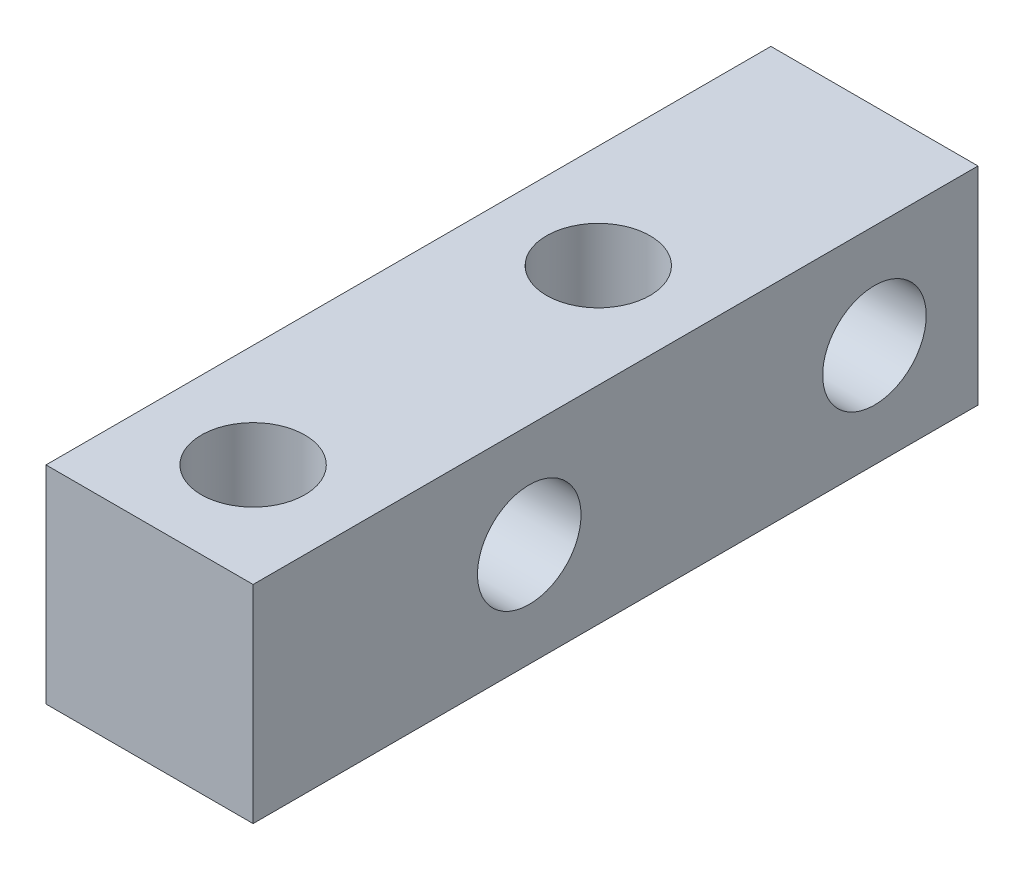
ISO-10303-21;
HEADER;
FILE_DESCRIPTION(('STEP AP214'),'2;1');
FILE_NAME('part.step','',(''),(''),'','','');
FILE_SCHEMA(('AUTOMOTIVE_DESIGN { 1 0 10303 214 1 1 1 1 }'));
ENDSEC;
DATA;
#1=APPLICATION_CONTEXT('core data for automotive mechanical design processes');
#2=APPLICATION_PROTOCOL_DEFINITION('international standard','automotive_design',2000,#1);
#3=PRODUCT_CONTEXT('',#1,'mechanical');
#4=PRODUCT('Part','Part','',(#3));
#5=PRODUCT_RELATED_PRODUCT_CATEGORY('part','',(#4));
#6=PRODUCT_DEFINITION_FORMATION('','',#4);
#7=PRODUCT_DEFINITION_CONTEXT('part definition',#1,'design');
#8=PRODUCT_DEFINITION('design','',#6,#7);
#9=PRODUCT_DEFINITION_SHAPE('','',#8);
#10=(LENGTH_UNIT() NAMED_UNIT(*) SI_UNIT(.MILLI.,.METRE.));
#11=(NAMED_UNIT(*) PLANE_ANGLE_UNIT() SI_UNIT($,.RADIAN.));
#12=(NAMED_UNIT(*) SI_UNIT($,.STERADIAN.) SOLID_ANGLE_UNIT());
#13=UNCERTAINTY_MEASURE_WITH_UNIT(LENGTH_MEASURE(1.E-05),#10,'distance_accuracy_value','');
#14=(GEOMETRIC_REPRESENTATION_CONTEXT(3) GLOBAL_UNCERTAINTY_ASSIGNED_CONTEXT((#13)) GLOBAL_UNIT_ASSIGNED_CONTEXT((#10,
#11,#12)) REPRESENTATION_CONTEXT('',''));
#15=CARTESIAN_POINT('',(0.,0.,0.));
#16=DIRECTION('',(0.,0.,1.));
#17=DIRECTION('',(1.,0.,0.));
#18=AXIS2_PLACEMENT_3D('',#15,#16,#17);
#19=CARTESIAN_POINT('',(0.,6.,0.));
#20=DIRECTION('',(0.,-1.,0.));
#21=DIRECTION('',(0.,0.,-1.));
#22=AXIS2_PLACEMENT_3D('',#19,#20,#21);
#23=PLANE('',#22);
#24=DIRECTION('',(0.,0.,1.));
#25=VECTOR('',#24,1.);
#26=CARTESIAN_POINT('',(-3.,6.,3.));
#27=LINE('',#26,#25);
#28=CARTESIAN_POINT('',(-3.,6.,-18.));
#29=VERTEX_POINT('',#28);
#30=CARTESIAN_POINT('',(-3.,6.,3.));
#31=VERTEX_POINT('',#30);
#32=EDGE_CURVE('E96',#29,#31,#27,.T.);
#33=ORIENTED_EDGE('',*,*,#32,.T.);
#34=DIRECTION('',(1.,0.,0.));
#35=VECTOR('',#34,1.);
#36=CARTESIAN_POINT('',(-3.,6.,3.));
#37=LINE('',#36,#35);
#38=CARTESIAN_POINT('',(3.,6.,3.));
#39=VERTEX_POINT('',#38);
#40=EDGE_CURVE('E91',#31,#39,#37,.T.);
#41=ORIENTED_EDGE('',*,*,#40,.T.);
#42=DIRECTION('',(0.,0.,-1.));
#43=VECTOR('',#42,1.);
#44=CARTESIAN_POINT('',(3.,6.,3.));
#45=LINE('',#44,#43);
#46=CARTESIAN_POINT('',(3.,6.,-18.));
#47=VERTEX_POINT('',#46);
#48=EDGE_CURVE('E94',#39,#47,#45,.T.);
#49=ORIENTED_EDGE('',*,*,#48,.T.);
#50=DIRECTION('',(-1.,0.,0.));
#51=VECTOR('',#50,1.);
#52=CARTESIAN_POINT('',(-3.,6.,-18.));
#53=LINE('',#52,#51);
#54=EDGE_CURVE('E61',#47,#29,#53,.T.);
#55=ORIENTED_EDGE('',*,*,#54,.T.);
#56=EDGE_LOOP('',(#33,#41,#49,#55));
#57=FACE_BOUND('',#56,.T.);
#58=CARTESIAN_POINT('',(0.,6.,0.));
#59=DIRECTION('',(0.,1.,0.));
#60=DIRECTION('',(0.,0.,1.));
#61=AXIS2_PLACEMENT_3D('',#58,#59,#60);
#62=CIRCLE('',#61,1.5);
#63=CARTESIAN_POINT('',(0.,6.,1.5));
#64=VERTEX_POINT('',#63);
#65=EDGE_CURVE('E111',#64,#64,#62,.T.);
#66=ORIENTED_EDGE('',*,*,#65,.F.);
#67=EDGE_LOOP('',(#66));
#68=FACE_BOUND('',#67,.T.);
#69=CARTESIAN_POINT('',(0.,6.,-10.));
#70=DIRECTION('',(0.,1.,0.));
#71=DIRECTION('',(0.,0.,1.));
#72=AXIS2_PLACEMENT_3D('',#69,#70,#71);
#73=CIRCLE('',#72,1.5);
#74=CARTESIAN_POINT('',(0.,6.,-8.5));
#75=VERTEX_POINT('',#74);
#76=EDGE_CURVE('E126',#75,#75,#73,.T.);
#77=ORIENTED_EDGE('',*,*,#76,.F.);
#78=EDGE_LOOP('',(#77));
#79=FACE_BOUND('',#78,.T.);
#80=ADVANCED_FACE('F44',(#57,#68,#79),#23,.F.);
#81=CARTESIAN_POINT('',(0.,0.,0.));
#82=DIRECTION('',(0.,-1.,0.));
#83=DIRECTION('',(0.,0.,-1.));
#84=AXIS2_PLACEMENT_3D('',#81,#82,#83);
#85=PLANE('',#84);
#86=CARTESIAN_POINT('',(0.,0.,0.));
#87=DIRECTION('',(0.,1.,0.));
#88=DIRECTION('',(0.,0.,1.));
#89=AXIS2_PLACEMENT_3D('',#86,#87,#88);
#90=CIRCLE('',#89,1.5);
#91=CARTESIAN_POINT('',(0.,0.,1.5));
#92=VERTEX_POINT('',#91);
#93=EDGE_CURVE('E123',#92,#92,#90,.T.);
#94=ORIENTED_EDGE('',*,*,#93,.T.);
#95=EDGE_LOOP('',(#94));
#96=FACE_BOUND('',#95,.T.);
#97=DIRECTION('',(0.,0.,1.));
#98=VECTOR('',#97,1.);
#99=CARTESIAN_POINT('',(-3.,0.,3.));
#100=LINE('',#99,#98);
#101=CARTESIAN_POINT('',(-3.,0.,-18.));
#102=VERTEX_POINT('',#101);
#103=CARTESIAN_POINT('',(-3.,0.,3.));
#104=VERTEX_POINT('',#103);
#105=EDGE_CURVE('E108',#102,#104,#100,.T.);
#106=ORIENTED_EDGE('',*,*,#105,.F.);
#107=DIRECTION('',(-1.,0.,0.));
#108=VECTOR('',#107,1.);
#109=CARTESIAN_POINT('',(-3.,0.,-18.));
#110=LINE('',#109,#108);
#111=CARTESIAN_POINT('',(3.,0.,-18.));
#112=VERTEX_POINT('',#111);
#113=EDGE_CURVE('E84',#112,#102,#110,.T.);
#114=ORIENTED_EDGE('',*,*,#113,.F.);
#115=DIRECTION('',(0.,0.,-1.));
#116=VECTOR('',#115,1.);
#117=CARTESIAN_POINT('',(3.,0.,3.));
#118=LINE('',#117,#116);
#119=CARTESIAN_POINT('',(3.,0.,3.));
#120=VERTEX_POINT('',#119);
#121=EDGE_CURVE('E78',#120,#112,#118,.T.);
#122=ORIENTED_EDGE('',*,*,#121,.F.);
#123=DIRECTION('',(1.,0.,0.));
#124=VECTOR('',#123,1.);
#125=CARTESIAN_POINT('',(-3.,0.,3.));
#126=LINE('',#125,#124);
#127=EDGE_CURVE('E100',#104,#120,#126,.T.);
#128=ORIENTED_EDGE('',*,*,#127,.F.);
#129=EDGE_LOOP('',(#106,#114,#122,#128));
#130=FACE_BOUND('',#129,.T.);
#131=CARTESIAN_POINT('',(0.,0.,-10.));
#132=DIRECTION('',(0.,1.,0.));
#133=DIRECTION('',(0.,0.,1.));
#134=AXIS2_PLACEMENT_3D('',#131,#132,#133);
#135=CIRCLE('',#134,1.5);
#136=CARTESIAN_POINT('',(0.,0.,-8.5));
#137=VERTEX_POINT('',#136);
#138=EDGE_CURVE('E129',#137,#137,#135,.T.);
#139=ORIENTED_EDGE('',*,*,#138,.T.);
#140=EDGE_LOOP('',(#139));
#141=FACE_BOUND('',#140,.T.);
#142=ADVANCED_FACE('F119',(#96,#130,#141),#85,.T.);
#143=CARTESIAN_POINT('',(-3.,6.,3.));
#144=DIRECTION('',(1.,0.,0.));
#145=DIRECTION('',(0.,0.,-1.));
#146=AXIS2_PLACEMENT_3D('',#143,#144,#145);
#147=PLANE('',#146);
#148=CARTESIAN_POINT('',(-3.,3.,-5.));
#149=DIRECTION('',(1.,0.,0.));
#150=DIRECTION('',(0.,0.,-1.));
#151=AXIS2_PLACEMENT_3D('',#148,#149,#150);
#152=CIRCLE('',#151,1.5);
#153=CARTESIAN_POINT('',(-3.,3.,-6.5));
#154=VERTEX_POINT('',#153);
#155=EDGE_CURVE('E132',#154,#154,#152,.T.);
#156=ORIENTED_EDGE('',*,*,#155,.T.);
#157=EDGE_LOOP('',(#156));
#158=FACE_BOUND('',#157,.T.);
#159=CARTESIAN_POINT('',(-3.,3.,-15.));
#160=DIRECTION('',(1.,0.,0.));
#161=DIRECTION('',(0.,0.,-1.));
#162=AXIS2_PLACEMENT_3D('',#159,#160,#161);
#163=CIRCLE('',#162,1.5);
#164=CARTESIAN_POINT('',(-3.,3.,-16.5));
#165=VERTEX_POINT('',#164);
#166=EDGE_CURVE('E135',#165,#165,#163,.T.);
#167=ORIENTED_EDGE('',*,*,#166,.T.);
#168=EDGE_LOOP('',(#167));
#169=FACE_BOUND('',#168,.T.);
#170=ORIENTED_EDGE('',*,*,#105,.T.);
#171=DIRECTION('',(0.,-1.,0.));
#172=VECTOR('',#171,1.);
#173=CARTESIAN_POINT('',(-3.,6.,3.));
#174=LINE('',#173,#172);
#175=EDGE_CURVE('E11',#31,#104,#174,.T.);
#176=ORIENTED_EDGE('',*,*,#175,.F.);
#177=ORIENTED_EDGE('',*,*,#32,.F.);
#178=DIRECTION('',(0.,-1.,0.));
#179=VECTOR('',#178,1.);
#180=CARTESIAN_POINT('',(-3.,6.,-18.));
#181=LINE('',#180,#179);
#182=EDGE_CURVE('E104',#29,#102,#181,.T.);
#183=ORIENTED_EDGE('',*,*,#182,.T.);
#184=EDGE_LOOP('',(#170,#176,#177,#183));
#185=FACE_BOUND('',#184,.T.);
#186=ADVANCED_FACE('F46',(#158,#169,#185),#147,.F.);
#187=CARTESIAN_POINT('',(-3.,6.,3.));
#188=DIRECTION('',(0.,0.,-1.));
#189=DIRECTION('',(-1.,0.,0.));
#190=AXIS2_PLACEMENT_3D('',#187,#188,#189);
#191=PLANE('',#190);
#192=ORIENTED_EDGE('',*,*,#127,.T.);
#193=DIRECTION('',(0.,-1.,0.));
#194=VECTOR('',#193,1.);
#195=CARTESIAN_POINT('',(3.,6.,3.));
#196=LINE('',#195,#194);
#197=EDGE_CURVE('E53',#39,#120,#196,.T.);
#198=ORIENTED_EDGE('',*,*,#197,.F.);
#199=ORIENTED_EDGE('',*,*,#40,.F.);
#200=ORIENTED_EDGE('',*,*,#175,.T.);
#201=EDGE_LOOP('',(#192,#198,#199,#200));
#202=FACE_BOUND('',#201,.T.);
#203=ADVANCED_FACE('F99',(#202),#191,.F.);
#204=CARTESIAN_POINT('',(3.,6.,3.));
#205=DIRECTION('',(-1.,0.,0.));
#206=DIRECTION('',(0.,0.,1.));
#207=AXIS2_PLACEMENT_3D('',#204,#205,#206);
#208=PLANE('',#207);
#209=CARTESIAN_POINT('',(3.,3.,-5.));
#210=DIRECTION('',(1.,0.,0.));
#211=DIRECTION('',(0.,0.,-1.));
#212=AXIS2_PLACEMENT_3D('',#209,#210,#211);
#213=CIRCLE('',#212,1.5);
#214=CARTESIAN_POINT('',(3.,3.,-6.5));
#215=VERTEX_POINT('',#214);
#216=EDGE_CURVE('E141',#215,#215,#213,.T.);
#217=ORIENTED_EDGE('',*,*,#216,.F.);
#218=EDGE_LOOP('',(#217));
#219=FACE_BOUND('',#218,.T.);
#220=CARTESIAN_POINT('',(3.,3.,-15.));
#221=DIRECTION('',(1.,0.,0.));
#222=DIRECTION('',(0.,0.,-1.));
#223=AXIS2_PLACEMENT_3D('',#220,#221,#222);
#224=CIRCLE('',#223,1.5);
#225=CARTESIAN_POINT('',(3.,3.,-16.5));
#226=VERTEX_POINT('',#225);
#227=EDGE_CURVE('E138',#226,#226,#224,.T.);
#228=ORIENTED_EDGE('',*,*,#227,.F.);
#229=EDGE_LOOP('',(#228));
#230=FACE_BOUND('',#229,.T.);
#231=ORIENTED_EDGE('',*,*,#121,.T.);
#232=DIRECTION('',(0.,-1.,0.));
#233=VECTOR('',#232,1.);
#234=CARTESIAN_POINT('',(3.,6.,-18.));
#235=LINE('',#234,#233);
#236=EDGE_CURVE('E101',#47,#112,#235,.T.);
#237=ORIENTED_EDGE('',*,*,#236,.F.);
#238=ORIENTED_EDGE('',*,*,#48,.F.);
#239=ORIENTED_EDGE('',*,*,#197,.T.);
#240=EDGE_LOOP('',(#231,#237,#238,#239));
#241=FACE_BOUND('',#240,.T.);
#242=ADVANCED_FACE('F102',(#219,#230,#241),#208,.F.);
#243=CARTESIAN_POINT('',(-3.,6.,-18.));
#244=DIRECTION('',(0.,0.,1.));
#245=DIRECTION('',(1.,0.,0.));
#246=AXIS2_PLACEMENT_3D('',#243,#244,#245);
#247=PLANE('',#246);
#248=ORIENTED_EDGE('',*,*,#113,.T.);
#249=ORIENTED_EDGE('',*,*,#182,.F.);
#250=ORIENTED_EDGE('',*,*,#54,.F.);
#251=ORIENTED_EDGE('',*,*,#236,.T.);
#252=EDGE_LOOP('',(#248,#249,#250,#251));
#253=FACE_BOUND('',#252,.T.);
#254=ADVANCED_FACE('F116',(#253),#247,.F.);
#255=CARTESIAN_POINT('',(0.,6.,0.));
#256=DIRECTION('',(0.,-1.,0.));
#257=DIRECTION('',(0.,0.,-1.));
#258=AXIS2_PLACEMENT_3D('',#255,#256,#257);
#259=CYLINDRICAL_SURFACE('',#258,1.5);
#260=ORIENTED_EDGE('',*,*,#65,.T.);
#261=EDGE_LOOP('',(#260));
#262=FACE_BOUND('',#261,.T.);
#263=ORIENTED_EDGE('',*,*,#93,.F.);
#264=EDGE_LOOP('',(#263));
#265=FACE_BOUND('',#264,.T.);
#266=ADVANCED_FACE('F168',(#262,#265),#259,.F.);
#267=CARTESIAN_POINT('',(0.,6.,-10.));
#268=DIRECTION('',(0.,-1.,0.));
#269=DIRECTION('',(0.,0.,-1.));
#270=AXIS2_PLACEMENT_3D('',#267,#268,#269);
#271=CYLINDRICAL_SURFACE('',#270,1.5);
#272=ORIENTED_EDGE('',*,*,#76,.T.);
#273=EDGE_LOOP('',(#272));
#274=FACE_BOUND('',#273,.T.);
#275=ORIENTED_EDGE('',*,*,#138,.F.);
#276=EDGE_LOOP('',(#275));
#277=FACE_BOUND('',#276,.T.);
#278=ADVANCED_FACE('F162',(#274,#277),#271,.F.);
#279=CARTESIAN_POINT('',(-3.,3.,-15.));
#280=DIRECTION('',(1.,0.,0.));
#281=DIRECTION('',(0.,0.,-1.));
#282=AXIS2_PLACEMENT_3D('',#279,#280,#281);
#283=CYLINDRICAL_SURFACE('',#282,1.5);
#284=ORIENTED_EDGE('',*,*,#166,.F.);
#285=EDGE_LOOP('',(#284));
#286=FACE_BOUND('',#285,.T.);
#287=ORIENTED_EDGE('',*,*,#227,.T.);
#288=EDGE_LOOP('',(#287));
#289=FACE_BOUND('',#288,.T.);
#290=ADVANCED_FACE('F152',(#286,#289),#283,.F.);
#291=CARTESIAN_POINT('',(-3.,3.,-5.));
#292=DIRECTION('',(1.,0.,0.));
#293=DIRECTION('',(0.,0.,-1.));
#294=AXIS2_PLACEMENT_3D('',#291,#292,#293);
#295=CYLINDRICAL_SURFACE('',#294,1.5);
#296=ORIENTED_EDGE('',*,*,#155,.F.);
#297=EDGE_LOOP('',(#296));
#298=FACE_BOUND('',#297,.T.);
#299=ORIENTED_EDGE('',*,*,#216,.T.);
#300=EDGE_LOOP('',(#299));
#301=FACE_BOUND('',#300,.T.);
#302=ADVANCED_FACE('F149',(#298,#301),#295,.F.);
#303=CLOSED_SHELL('',(#80,#142,#186,#203,#242,#254,#266,#278,#290,#302));
#304=MANIFOLD_SOLID_BREP('B2',#303);
#305=ADVANCED_BREP_SHAPE_REPRESENTATION('',(#18,#304),#14);
#306=SHAPE_DEFINITION_REPRESENTATION(#9,#305);
ENDSEC;
END-ISO-10303-21;
